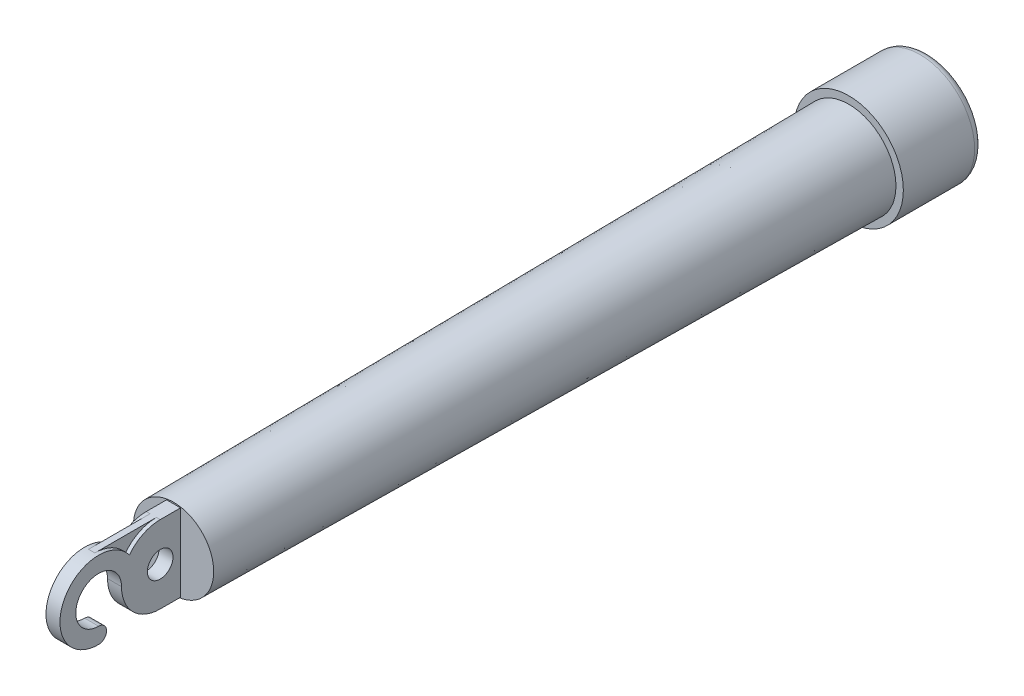
ISO-10303-21;
HEADER;
FILE_DESCRIPTION(('STEP AP214'),'2;1');
FILE_NAME('part.step','',(''),(''),'','','');
FILE_SCHEMA(('AUTOMOTIVE_DESIGN { 1 0 10303 214 1 1 1 1 }'));
ENDSEC;
DATA;
#1=APPLICATION_CONTEXT('core data for automotive mechanical design processes');
#2=APPLICATION_PROTOCOL_DEFINITION('international standard','automotive_design',2000,#1);
#3=PRODUCT_CONTEXT('',#1,'mechanical');
#4=PRODUCT('Part','Part','',(#3));
#5=PRODUCT_RELATED_PRODUCT_CATEGORY('part','',(#4));
#6=PRODUCT_DEFINITION_FORMATION('','',#4);
#7=PRODUCT_DEFINITION_CONTEXT('part definition',#1,'design');
#8=PRODUCT_DEFINITION('design','',#6,#7);
#9=PRODUCT_DEFINITION_SHAPE('','',#8);
#10=(LENGTH_UNIT() NAMED_UNIT(*) SI_UNIT(.MILLI.,.METRE.));
#11=(NAMED_UNIT(*) PLANE_ANGLE_UNIT() SI_UNIT($,.RADIAN.));
#12=(NAMED_UNIT(*) SI_UNIT($,.STERADIAN.) SOLID_ANGLE_UNIT());
#13=UNCERTAINTY_MEASURE_WITH_UNIT(LENGTH_MEASURE(1.E-05),#10,'distance_accuracy_value','');
#14=(GEOMETRIC_REPRESENTATION_CONTEXT(3) GLOBAL_UNCERTAINTY_ASSIGNED_CONTEXT((#13)) GLOBAL_UNIT_ASSIGNED_CONTEXT((#10,
#11,#12)) REPRESENTATION_CONTEXT('',''));
#15=CARTESIAN_POINT('',(0.,0.,0.));
#16=DIRECTION('',(0.,0.,1.));
#17=DIRECTION('',(1.,0.,0.));
#18=AXIS2_PLACEMENT_3D('',#15,#16,#17);
#19=CARTESIAN_POINT('',(-1.2,6.65,150.39));
#20=DIRECTION('',(0.,-1.,0.));
#21=DIRECTION('',(0.,0.,-1.));
#22=AXIS2_PLACEMENT_3D('',#19,#20,#21);
#23=PLANE('',#22);
#24=DIRECTION('',(-1.,0.,0.));
#25=VECTOR('',#24,1.);
#26=CARTESIAN_POINT('',(-0.545,6.64999999999998,133.164251340283));
#27=LINE('',#26,#25);
#28=CARTESIAN_POINT('',(-0.545,6.64999999999998,133.164251340283));
#29=VERTEX_POINT('',#28);
#30=CARTESIAN_POINT('',(-1.2,6.64999999999998,133.164251340283));
#31=VERTEX_POINT('',#30);
#32=EDGE_CURVE('E170',#29,#31,#27,.T.);
#33=ORIENTED_EDGE('',*,*,#32,.F.);
#34=DIRECTION('',(0.,0.,1.));
#35=VECTOR('',#34,1.);
#36=CARTESIAN_POINT('',(-0.545,6.65000000000001,143.739251340283));
#37=LINE('',#36,#35);
#38=CARTESIAN_POINT('',(-0.545,6.65000000000001,143.739251340283));
#39=VERTEX_POINT('',#38);
#40=EDGE_CURVE('E166',#29,#39,#37,.T.);
#41=ORIENTED_EDGE('',*,*,#40,.T.);
#42=DIRECTION('',(1.,0.,0.));
#43=VECTOR('',#42,1.);
#44=CARTESIAN_POINT('',(-9.376,6.65000000000001,143.739251340283));
#45=LINE('',#44,#43);
#46=CARTESIAN_POINT('',(0.545,6.65000000000001,143.739251340283));
#47=VERTEX_POINT('',#46);
#48=EDGE_CURVE('E53',#39,#47,#45,.T.);
#49=ORIENTED_EDGE('',*,*,#48,.T.);
#50=DIRECTION('',(0.,0.,1.));
#51=VECTOR('',#50,1.);
#52=CARTESIAN_POINT('',(0.545,6.65000000000001,143.739251340283));
#53=LINE('',#52,#51);
#54=CARTESIAN_POINT('',(0.545,6.64999999999998,133.164251340283));
#55=VERTEX_POINT('',#54);
#56=EDGE_CURVE('E184',#55,#47,#53,.T.);
#57=ORIENTED_EDGE('',*,*,#56,.F.);
#58=DIRECTION('',(1.,0.,0.));
#59=VECTOR('',#58,1.);
#60=CARTESIAN_POINT('',(0.545,6.64999999999998,133.164251340283));
#61=LINE('',#60,#59);
#62=CARTESIAN_POINT('',(1.2,6.64999999999998,133.164251340283));
#63=VERTEX_POINT('',#62);
#64=EDGE_CURVE('E188',#55,#63,#61,.T.);
#65=ORIENTED_EDGE('',*,*,#64,.T.);
#66=DIRECTION('',(0.,0.,-1.));
#67=VECTOR('',#66,1.);
#68=CARTESIAN_POINT('',(1.2,6.65,150.39));
#69=LINE('',#68,#67);
#70=CARTESIAN_POINT('',(1.2,6.65,129.67));
#71=VERTEX_POINT('',#70);
#72=EDGE_CURVE('E214',#63,#71,#69,.T.);
#73=ORIENTED_EDGE('',*,*,#72,.T.);
#74=DIRECTION('',(-1.,0.,0.));
#75=VECTOR('',#74,1.);
#76=CARTESIAN_POINT('',(-1.2,6.65,129.67));
#77=LINE('',#76,#75);
#78=CARTESIAN_POINT('',(-1.2,6.65,129.67));
#79=VERTEX_POINT('',#78);
#80=EDGE_CURVE('E202',#71,#79,#77,.T.);
#81=ORIENTED_EDGE('',*,*,#80,.T.);
#82=DIRECTION('',(0.,0.,-1.));
#83=VECTOR('',#82,1.);
#84=CARTESIAN_POINT('',(-1.2,6.65,150.39));
#85=LINE('',#84,#83);
#86=EDGE_CURVE('E212',#31,#79,#85,.T.);
#87=ORIENTED_EDGE('',*,*,#86,.F.);
#88=EDGE_LOOP('',(#33,#41,#49,#57,#65,#73,#81,#87));
#89=FACE_BOUND('',#88,.T.);
#90=ADVANCED_FACE('F38',(#89),#23,.F.);
#91=CARTESIAN_POINT('',(-1.2,-6.65,150.39));
#92=DIRECTION('',(1.,0.,0.));
#93=DIRECTION('',(0.,0.,-1.));
#94=AXIS2_PLACEMENT_3D('',#91,#92,#93);
#95=PLANE('',#94);
#96=CARTESIAN_POINT('',(-1.2,0.,133.164251340283));
#97=DIRECTION('',(1.,0.,0.));
#98=DIRECTION('',(0.,0.,-1.));
#99=AXIS2_PLACEMENT_3D('',#96,#97,#98);
#100=CIRCLE('',#99,2.20000000000001);
#101=CARTESIAN_POINT('',(-1.2,0.,130.964251340283));
#102=VERTEX_POINT('',#101);
#103=EDGE_CURVE('E153',#102,#102,#100,.F.);
#104=ORIENTED_EDGE('',*,*,#103,.F.);
#105=EDGE_LOOP('',(#104));
#106=FACE_BOUND('',#105,.T.);
#107=DIRECTION('',(0.,0.,-1.));
#108=VECTOR('',#107,1.);
#109=CARTESIAN_POINT('',(-1.2,-6.65,150.39));
#110=LINE('',#109,#108);
#111=CARTESIAN_POINT('',(-1.2,-6.64999999999998,133.164251340283));
#112=VERTEX_POINT('',#111);
#113=CARTESIAN_POINT('',(-1.2,-6.65,129.67));
#114=VERTEX_POINT('',#113);
#115=EDGE_CURVE('E61',#112,#114,#110,.T.);
#116=ORIENTED_EDGE('',*,*,#115,.F.);
#117=CARTESIAN_POINT('',(-1.2,0.,133.164251340283));
#118=DIRECTION('',(1.,0.,0.));
#119=DIRECTION('',(0.,0.,-1.));
#120=AXIS2_PLACEMENT_3D('',#117,#118,#119);
#121=CIRCLE('',#120,6.64999999999998);
#122=CARTESIAN_POINT('',(-1.2,0.,139.814251340283));
#123=VERTEX_POINT('',#122);
#124=EDGE_CURVE('E132',#123,#112,#121,.T.);
#125=ORIENTED_EDGE('',*,*,#124,.F.);
#126=CARTESIAN_POINT('',(-1.2,0.,143.739251340283));
#127=DIRECTION('',(1.,0.,0.));
#128=DIRECTION('',(0.,0.,-1.));
#129=AXIS2_PLACEMENT_3D('',#126,#127,#128);
#130=CIRCLE('',#129,3.92500000000001);
#131=CARTESIAN_POINT('',(-1.2,-3.925,143.739251340283));
#132=VERTEX_POINT('',#131);
#133=EDGE_CURVE('E126',#132,#123,#130,.F.);
#134=ORIENTED_EDGE('',*,*,#133,.F.);
#135=CARTESIAN_POINT('',(-1.2,-5.28750000000001,143.739251340283));
#136=DIRECTION('',(1.,0.,0.));
#137=DIRECTION('',(0.,0.,-1.));
#138=AXIS2_PLACEMENT_3D('',#135,#136,#137);
#139=CIRCLE('',#138,1.36250000000001);
#140=CARTESIAN_POINT('',(-1.2,-6.65000000000002,143.739251340283));
#141=VERTEX_POINT('',#140);
#142=EDGE_CURVE('E130',#132,#141,#139,.F.);
#143=ORIENTED_EDGE('',*,*,#142,.T.);
#144=CARTESIAN_POINT('',(-1.2,0.,143.739251340283));
#145=DIRECTION('',(1.,0.,0.));
#146=DIRECTION('',(0.,0.,-1.));
#147=AXIS2_PLACEMENT_3D('',#144,#145,#146);
#148=CIRCLE('',#147,6.65000000000001);
#149=CARTESIAN_POINT('',(-1.2,4.03296959447997,138.451751340283));
#150=VERTEX_POINT('',#149);
#151=EDGE_CURVE('E191',#150,#141,#148,.T.);
#152=ORIENTED_EDGE('',*,*,#151,.F.);
#153=CARTESIAN_POINT('',(-1.2,0.,133.164251340283));
#154=DIRECTION('',(-1.,0.,0.));
#155=DIRECTION('',(0.,0.,1.));
#156=AXIS2_PLACEMENT_3D('',#153,#154,#155);
#157=CIRCLE('',#156,6.64999999999997);
#158=EDGE_CURVE('E161',#150,#31,#157,.T.);
#159=ORIENTED_EDGE('',*,*,#158,.T.);
#160=ORIENTED_EDGE('',*,*,#86,.T.);
#161=DIRECTION('',(0.,-1.,0.));
#162=VECTOR('',#161,1.);
#163=CARTESIAN_POINT('',(-1.2,-6.65,129.67));
#164=LINE('',#163,#162);
#165=EDGE_CURVE('E205',#79,#114,#164,.T.);
#166=ORIENTED_EDGE('',*,*,#165,.T.);
#167=EDGE_LOOP('',(#116,#125,#134,#143,#152,#159,#160,#166));
#168=FACE_BOUND('',#167,.T.);
#169=ADVANCED_FACE('F128',(#106,#168),#95,.F.);
#170=CARTESIAN_POINT('',(0.,0.,129.67));
#171=DIRECTION('',(0.,0.,1.));
#172=DIRECTION('',(1.,0.,0.));
#173=AXIS2_PLACEMENT_3D('',#170,#171,#172);
#174=PLANE('',#173);
#175=CARTESIAN_POINT('',(0.,0.,129.67));
#176=DIRECTION('',(0.,0.,1.));
#177=DIRECTION('',(1.,0.,0.));
#178=AXIS2_PLACEMENT_3D('',#175,#176,#177);
#179=CIRCLE('',#178,6.9);
#180=CARTESIAN_POINT('',(6.9,0.,129.67));
#181=VERTEX_POINT('',#180);
#182=EDGE_CURVE('E221',#181,#181,#179,.T.);
#183=ORIENTED_EDGE('',*,*,#182,.T.);
#184=EDGE_LOOP('',(#183));
#185=FACE_BOUND('',#184,.T.);
#186=ORIENTED_EDGE('',*,*,#80,.F.);
#187=DIRECTION('',(0.,1.,0.));
#188=VECTOR('',#187,1.);
#189=CARTESIAN_POINT('',(1.2,-6.65,129.67));
#190=LINE('',#189,#188);
#191=CARTESIAN_POINT('',(1.2,-6.65,129.67));
#192=VERTEX_POINT('',#191);
#193=EDGE_CURVE('E198',#192,#71,#190,.T.);
#194=ORIENTED_EDGE('',*,*,#193,.F.);
#195=DIRECTION('',(1.,0.,0.));
#196=VECTOR('',#195,1.);
#197=CARTESIAN_POINT('',(-1.2,-6.65,129.67));
#198=LINE('',#197,#196);
#199=EDGE_CURVE('E207',#114,#192,#198,.T.);
#200=ORIENTED_EDGE('',*,*,#199,.F.);
#201=ORIENTED_EDGE('',*,*,#165,.F.);
#202=EDGE_LOOP('',(#186,#194,#200,#201));
#203=FACE_BOUND('',#202,.T.);
#204=ADVANCED_FACE('F238',(#185,#203),#174,.T.);
#205=CARTESIAN_POINT('',(0.,0.,13.65));
#206=DIRECTION('',(0.,0.,1.));
#207=DIRECTION('',(1.,0.,0.));
#208=AXIS2_PLACEMENT_3D('',#205,#206,#207);
#209=PLANE('',#208);
#210=CARTESIAN_POINT('',(0.,0.,13.65));
#211=DIRECTION('',(0.,0.,1.));
#212=DIRECTION('',(1.,0.,0.));
#213=AXIS2_PLACEMENT_3D('',#210,#211,#212);
#214=CIRCLE('',#213,9.375);
#215=CARTESIAN_POINT('',(9.375,0.,13.65));
#216=VERTEX_POINT('',#215);
#217=EDGE_CURVE('E498',#216,#216,#214,.T.);
#218=ORIENTED_EDGE('',*,*,#217,.T.);
#219=EDGE_LOOP('',(#218));
#220=FACE_BOUND('',#219,.T.);
#221=CARTESIAN_POINT('',(0.,0.,13.65));
#222=DIRECTION('',(0.,0.,1.));
#223=DIRECTION('',(1.,0.,0.));
#224=AXIS2_PLACEMENT_3D('',#221,#222,#223);
#225=CIRCLE('',#224,8.105);
#226=CARTESIAN_POINT('',(8.105,0.,13.65));
#227=VERTEX_POINT('',#226);
#228=EDGE_CURVE('E216',#227,#227,#225,.T.);
#229=ORIENTED_EDGE('',*,*,#228,.F.);
#230=EDGE_LOOP('',(#229));
#231=FACE_BOUND('',#230,.T.);
#232=ADVANCED_FACE('F250',(#220,#231),#209,.T.);
#233=CARTESIAN_POINT('',(0.,0.,13.65));
#234=DIRECTION('',(0.,0.,-1.));
#235=DIRECTION('',(-1.,0.,0.));
#236=AXIS2_PLACEMENT_3D('',#233,#234,#235);
#237=CYLINDRICAL_SURFACE('',#236,9.375);
#238=CARTESIAN_POINT('',(0.,0.,1.4));
#239=DIRECTION('',(0.,0.,1.));
#240=DIRECTION('',(1.,0.,0.));
#241=AXIS2_PLACEMENT_3D('',#238,#239,#240);
#242=CIRCLE('',#241,9.375);
#243=CARTESIAN_POINT('',(9.375,0.,1.4));
#244=VERTEX_POINT('',#243);
#245=EDGE_CURVE('E493',#244,#244,#242,.T.);
#246=ORIENTED_EDGE('',*,*,#245,.T.);
#247=EDGE_LOOP('',(#246));
#248=FACE_BOUND('',#247,.T.);
#249=ORIENTED_EDGE('',*,*,#217,.F.);
#250=EDGE_LOOP('',(#249));
#251=FACE_BOUND('',#250,.T.);
#252=ADVANCED_FACE('F253',(#248,#251),#237,.T.);
#253=CARTESIAN_POINT('',(0.,0.,0.));
#254=DIRECTION('',(0.,0.,1.));
#255=DIRECTION('',(1.,0.,0.));
#256=AXIS2_PLACEMENT_3D('',#253,#254,#255);
#257=PLANE('',#256);
#258=CARTESIAN_POINT('',(0.,0.,0.));
#259=DIRECTION('',(0.,0.,1.));
#260=DIRECTION('',(1.,0.,0.));
#261=AXIS2_PLACEMENT_3D('',#258,#259,#260);
#262=CIRCLE('',#261,5.4);
#263=CARTESIAN_POINT('',(5.4,0.,0.));
#264=VERTEX_POINT('',#263);
#265=EDGE_CURVE('E12',#264,#264,#262,.T.);
#266=ORIENTED_EDGE('',*,*,#265,.T.);
#267=EDGE_LOOP('',(#266));
#268=FACE_BOUND('',#267,.T.);
#269=CARTESIAN_POINT('',(0.,0.,0.));
#270=DIRECTION('',(0.,0.,1.));
#271=DIRECTION('',(1.,0.,0.));
#272=AXIS2_PLACEMENT_3D('',#269,#270,#271);
#273=CIRCLE('',#272,7.975);
#274=CARTESIAN_POINT('',(7.975,0.,0.));
#275=VERTEX_POINT('',#274);
#276=EDGE_CURVE('E491',#275,#275,#273,.F.);
#277=ORIENTED_EDGE('',*,*,#276,.T.);
#278=EDGE_LOOP('',(#277));
#279=FACE_BOUND('',#278,.T.);
#280=ADVANCED_FACE('F255',(#268,#279),#257,.F.);
#281=CARTESIAN_POINT('',(0.,0.,1.4));
#282=DIRECTION('',(0.,0.,1.));
#283=DIRECTION('',(1.,0.,0.));
#284=AXIS2_PLACEMENT_3D('',#281,#282,#283);
#285=TOROIDAL_SURFACE('',#284,7.975,1.4);
#286=ORIENTED_EDGE('',*,*,#276,.F.);
#287=EDGE_LOOP('',(#286));
#288=FACE_BOUND('',#287,.T.);
#289=ORIENTED_EDGE('',*,*,#245,.F.);
#290=EDGE_LOOP('',(#289));
#291=FACE_BOUND('',#290,.T.);
#292=ADVANCED_FACE('F248',(#288,#291),#285,.T.);
#293=CARTESIAN_POINT('',(0.,0.,9.3));
#294=DIRECTION('',(0.,0.,-1.));
#295=DIRECTION('',(-1.,0.,0.));
#296=AXIS2_PLACEMENT_3D('',#293,#294,#295);
#297=CYLINDRICAL_SURFACE('',#296,4.4);
#298=CARTESIAN_POINT('',(0.,0.,0.999999999999999));
#299=DIRECTION('',(0.,0.,1.));
#300=DIRECTION('',(1.,0.,0.));
#301=AXIS2_PLACEMENT_3D('',#298,#299,#300);
#302=CIRCLE('',#301,4.4);
#303=CARTESIAN_POINT('',(4.4,0.,0.999999999999999));
#304=VERTEX_POINT('',#303);
#305=EDGE_CURVE('E46',#304,#304,#302,.F.);
#306=ORIENTED_EDGE('',*,*,#305,.T.);
#307=EDGE_LOOP('',(#306));
#308=FACE_BOUND('',#307,.T.);
#309=CARTESIAN_POINT('',(0.,0.,9.3));
#310=DIRECTION('',(0.,0.,-1.));
#311=DIRECTION('',(-1.,0.,0.));
#312=AXIS2_PLACEMENT_3D('',#309,#310,#311);
#313=CIRCLE('',#312,4.4);
#314=CARTESIAN_POINT('',(-4.4,0.,9.3));
#315=VERTEX_POINT('',#314);
#316=EDGE_CURVE('E501',#315,#315,#313,.T.);
#317=ORIENTED_EDGE('',*,*,#316,.F.);
#318=EDGE_LOOP('',(#317));
#319=FACE_BOUND('',#318,.T.);
#320=ADVANCED_FACE('F244',(#308,#319),#297,.F.);
#321=CARTESIAN_POINT('',(0.,0.,9.3));
#322=DIRECTION('',(0.,0.,-1.));
#323=DIRECTION('',(-1.,0.,0.));
#324=AXIS2_PLACEMENT_3D('',#321,#322,#323);
#325=PLANE('',#324);
#326=ORIENTED_EDGE('',*,*,#316,.T.);
#327=EDGE_LOOP('',(#326));
#328=FACE_BOUND('',#327,.T.);
#329=ADVANCED_FACE('F241',(#328),#325,.T.);
#330=CARTESIAN_POINT('',(0.,0.,0.999999999999999));
#331=DIRECTION('',(0.,0.,1.));
#332=DIRECTION('',(1.,0.,0.));
#333=AXIS2_PLACEMENT_3D('',#330,#331,#332);
#334=TOROIDAL_SURFACE('',#333,5.4,1.);
#335=ORIENTED_EDGE('',*,*,#265,.F.);
#336=EDGE_LOOP('',(#335));
#337=FACE_BOUND('',#336,.T.);
#338=ORIENTED_EDGE('',*,*,#305,.F.);
#339=EDGE_LOOP('',(#338));
#340=FACE_BOUND('',#339,.T.);
#341=ADVANCED_FACE('F40',(#337,#340),#334,.T.);
#342=CARTESIAN_POINT('',(0.,0.,129.67));
#343=DIRECTION('',(0.,0.,-1.));
#344=DIRECTION('',(-1.,0.,0.));
#345=AXIS2_PLACEMENT_3D('',#342,#343,#344);
#346=CONICAL_SURFACE('',#345,6.9,0.0103857668872033);
#347=ORIENTED_EDGE('',*,*,#182,.F.);
#348=EDGE_LOOP('',(#347));
#349=FACE_BOUND('',#348,.T.);
#350=ORIENTED_EDGE('',*,*,#228,.T.);
#351=EDGE_LOOP('',(#350));
#352=FACE_BOUND('',#351,.T.);
#353=ADVANCED_FACE('F227',(#349,#352),#346,.T.);
#354=CARTESIAN_POINT('',(1.2,-6.65,150.39));
#355=DIRECTION('',(-1.,0.,0.));
#356=DIRECTION('',(0.,0.,1.));
#357=AXIS2_PLACEMENT_3D('',#354,#355,#356);
#358=PLANE('',#357);
#359=CARTESIAN_POINT('',(1.2,0.,133.164251340283));
#360=DIRECTION('',(1.,0.,0.));
#361=DIRECTION('',(0.,0.,-1.));
#362=AXIS2_PLACEMENT_3D('',#359,#360,#361);
#363=CIRCLE('',#362,2.20000000000001);
#364=CARTESIAN_POINT('',(1.2,0.,130.964251340283));
#365=VERTEX_POINT('',#364);
#366=EDGE_CURVE('E286',#365,#365,#363,.T.);
#367=ORIENTED_EDGE('',*,*,#366,.F.);
#368=EDGE_LOOP('',(#367));
#369=FACE_BOUND('',#368,.T.);
#370=CARTESIAN_POINT('',(1.2,0.,143.739251340283));
#371=DIRECTION('',(1.,0.,0.));
#372=DIRECTION('',(0.,0.,-1.));
#373=AXIS2_PLACEMENT_3D('',#370,#371,#372);
#374=CIRCLE('',#373,3.92500000000001);
#375=CARTESIAN_POINT('',(1.2,0.,139.814251340283));
#376=VERTEX_POINT('',#375);
#377=CARTESIAN_POINT('',(1.2,-3.92500000000001,143.739251340283));
#378=VERTEX_POINT('',#377);
#379=EDGE_CURVE('E135',#376,#378,#374,.T.);
#380=ORIENTED_EDGE('',*,*,#379,.F.);
#381=CARTESIAN_POINT('',(1.2,0.,133.164251340283));
#382=DIRECTION('',(-1.,0.,0.));
#383=DIRECTION('',(0.,0.,1.));
#384=AXIS2_PLACEMENT_3D('',#381,#382,#383);
#385=CIRCLE('',#384,6.64999999999998);
#386=CARTESIAN_POINT('',(1.2,-6.64999999999998,133.164251340283));
#387=VERTEX_POINT('',#386);
#388=EDGE_CURVE('E151',#387,#376,#385,.T.);
#389=ORIENTED_EDGE('',*,*,#388,.F.);
#390=DIRECTION('',(0.,0.,-1.));
#391=VECTOR('',#390,1.);
#392=CARTESIAN_POINT('',(1.2,-6.65,150.39));
#393=LINE('',#392,#391);
#394=EDGE_CURVE('E209',#387,#192,#393,.T.);
#395=ORIENTED_EDGE('',*,*,#394,.T.);
#396=ORIENTED_EDGE('',*,*,#193,.T.);
#397=ORIENTED_EDGE('',*,*,#72,.F.);
#398=CARTESIAN_POINT('',(1.2,0.,133.164251340283));
#399=DIRECTION('',(-1.,0.,0.));
#400=DIRECTION('',(0.,0.,1.));
#401=AXIS2_PLACEMENT_3D('',#398,#399,#400);
#402=CIRCLE('',#401,6.64999999999997);
#403=CARTESIAN_POINT('',(1.2,4.03296959447997,138.451751340283));
#404=VERTEX_POINT('',#403);
#405=EDGE_CURVE('E176',#404,#63,#402,.T.);
#406=ORIENTED_EDGE('',*,*,#405,.F.);
#407=CARTESIAN_POINT('',(1.2,0.,143.739251340283));
#408=DIRECTION('',(-1.,0.,0.));
#409=DIRECTION('',(0.,0.,-1.));
#410=AXIS2_PLACEMENT_3D('',#407,#408,#409);
#411=CIRCLE('',#410,6.65000000000001);
#412=CARTESIAN_POINT('',(1.2,-6.65000000000002,143.739251340283));
#413=VERTEX_POINT('',#412);
#414=EDGE_CURVE('E195',#413,#404,#411,.T.);
#415=ORIENTED_EDGE('',*,*,#414,.F.);
#416=CARTESIAN_POINT('',(1.2,-5.28750000000001,143.739251340283));
#417=DIRECTION('',(1.,0.,0.));
#418=DIRECTION('',(0.,0.,-1.));
#419=AXIS2_PLACEMENT_3D('',#416,#417,#418);
#420=CIRCLE('',#419,1.36250000000001);
#421=EDGE_CURVE('E149',#413,#378,#420,.T.);
#422=ORIENTED_EDGE('',*,*,#421,.T.);
#423=EDGE_LOOP('',(#380,#389,#395,#396,#397,#406,#415,#422));
#424=FACE_BOUND('',#423,.T.);
#425=ADVANCED_FACE('F237',(#369,#424),#358,.F.);
#426=CARTESIAN_POINT('',(-1.2,-6.65,150.39));
#427=DIRECTION('',(0.,1.,0.));
#428=DIRECTION('',(0.,0.,1.));
#429=AXIS2_PLACEMENT_3D('',#426,#427,#428);
#430=PLANE('',#429);
#431=ORIENTED_EDGE('',*,*,#394,.F.);
#432=DIRECTION('',(1.,0.,0.));
#433=VECTOR('',#432,1.);
#434=CARTESIAN_POINT('',(-9.376,-6.64999999999998,133.164251340283));
#435=LINE('',#434,#433);
#436=EDGE_CURVE('E136',#112,#387,#435,.T.);
#437=ORIENTED_EDGE('',*,*,#436,.F.);
#438=ORIENTED_EDGE('',*,*,#115,.T.);
#439=ORIENTED_EDGE('',*,*,#199,.T.);
#440=EDGE_LOOP('',(#431,#437,#438,#439));
#441=FACE_BOUND('',#440,.T.);
#442=ADVANCED_FACE('F277',(#441),#430,.F.);
#443=CARTESIAN_POINT('',(-9.376,0.,143.739251340283));
#444=DIRECTION('',(1.,0.,0.));
#445=DIRECTION('',(0.,0.,-1.));
#446=AXIS2_PLACEMENT_3D('',#443,#444,#445);
#447=CYLINDRICAL_SURFACE('',#446,6.65000000000001);
#448=ORIENTED_EDGE('',*,*,#151,.T.);
#449=DIRECTION('',(1.,0.,0.));
#450=VECTOR('',#449,1.);
#451=CARTESIAN_POINT('',(-9.376,-6.65000000000002,143.739251340283));
#452=LINE('',#451,#450);
#453=EDGE_CURVE('E148',#141,#413,#452,.T.);
#454=ORIENTED_EDGE('',*,*,#453,.T.);
#455=ORIENTED_EDGE('',*,*,#414,.T.);
#456=DIRECTION('',(1.,0.,0.));
#457=VECTOR('',#456,1.);
#458=CARTESIAN_POINT('',(0.545,4.03296959447997,138.451751340283));
#459=LINE('',#458,#457);
#460=CARTESIAN_POINT('',(0.545,4.03296959447997,138.451751340283));
#461=VERTEX_POINT('',#460);
#462=EDGE_CURVE('E186',#461,#404,#459,.T.);
#463=ORIENTED_EDGE('',*,*,#462,.F.);
#464=CARTESIAN_POINT('',(0.545,0.,143.739251340283));
#465=DIRECTION('',(-1.,0.,0.));
#466=DIRECTION('',(0.,0.,1.));
#467=AXIS2_PLACEMENT_3D('',#464,#465,#466);
#468=CIRCLE('',#467,6.65000000000001);
#469=EDGE_CURVE('E178',#47,#461,#468,.T.);
#470=ORIENTED_EDGE('',*,*,#469,.F.);
#471=ORIENTED_EDGE('',*,*,#48,.F.);
#472=CARTESIAN_POINT('',(-0.545,0.,143.739251340283));
#473=DIRECTION('',(-1.,0.,0.));
#474=DIRECTION('',(0.,0.,1.));
#475=AXIS2_PLACEMENT_3D('',#472,#473,#474);
#476=CIRCLE('',#475,6.65000000000001);
#477=CARTESIAN_POINT('',(-0.545,4.03296959447997,138.451751340283));
#478=VERTEX_POINT('',#477);
#479=EDGE_CURVE('E163',#39,#478,#476,.T.);
#480=ORIENTED_EDGE('',*,*,#479,.T.);
#481=DIRECTION('',(-1.,0.,0.));
#482=VECTOR('',#481,1.);
#483=CARTESIAN_POINT('',(-0.545,4.03296959447997,138.451751340283));
#484=LINE('',#483,#482);
#485=EDGE_CURVE('E173',#478,#150,#484,.T.);
#486=ORIENTED_EDGE('',*,*,#485,.T.);
#487=EDGE_LOOP('',(#448,#454,#455,#463,#470,#471,#480,#486));
#488=FACE_BOUND('',#487,.T.);
#489=ADVANCED_FACE('F282',(#488),#447,.T.);
#490=CARTESIAN_POINT('',(0.545,0.,133.164251340283));
#491=DIRECTION('',(1.,0.,0.));
#492=DIRECTION('',(0.,0.,-1.));
#493=AXIS2_PLACEMENT_3D('',#490,#491,#492);
#494=CYLINDRICAL_SURFACE('',#493,6.64999999999997);
#495=ORIENTED_EDGE('',*,*,#405,.T.);
#496=ORIENTED_EDGE('',*,*,#64,.F.);
#497=CARTESIAN_POINT('',(0.545,0.,133.164251340283));
#498=DIRECTION('',(-1.,0.,0.));
#499=DIRECTION('',(0.,0.,1.));
#500=AXIS2_PLACEMENT_3D('',#497,#498,#499);
#501=CIRCLE('',#500,6.64999999999997);
#502=EDGE_CURVE('E181',#461,#55,#501,.T.);
#503=ORIENTED_EDGE('',*,*,#502,.F.);
#504=ORIENTED_EDGE('',*,*,#462,.T.);
#505=EDGE_LOOP('',(#495,#496,#503,#504));
#506=FACE_BOUND('',#505,.T.);
#507=ADVANCED_FACE('F296',(#506),#494,.T.);
#508=CARTESIAN_POINT('',(0.545,0.,143.739251340283));
#509=DIRECTION('',(-1.,0.,0.));
#510=DIRECTION('',(0.,0.,1.));
#511=AXIS2_PLACEMENT_3D('',#508,#509,#510);
#512=PLANE('',#511);
#513=ORIENTED_EDGE('',*,*,#469,.T.);
#514=ORIENTED_EDGE('',*,*,#502,.T.);
#515=ORIENTED_EDGE('',*,*,#56,.T.);
#516=EDGE_LOOP('',(#513,#514,#515));
#517=FACE_BOUND('',#516,.T.);
#518=ADVANCED_FACE('F298',(#517),#512,.F.);
#519=CARTESIAN_POINT('',(-0.545,0.,133.164251340283));
#520=DIRECTION('',(-1.,0.,0.));
#521=DIRECTION('',(0.,0.,1.));
#522=AXIS2_PLACEMENT_3D('',#519,#520,#521);
#523=CYLINDRICAL_SURFACE('',#522,6.64999999999997);
#524=ORIENTED_EDGE('',*,*,#158,.F.);
#525=ORIENTED_EDGE('',*,*,#485,.F.);
#526=CARTESIAN_POINT('',(-0.545,0.,133.164251340283));
#527=DIRECTION('',(-1.,0.,0.));
#528=DIRECTION('',(0.,0.,1.));
#529=AXIS2_PLACEMENT_3D('',#526,#527,#528);
#530=CIRCLE('',#529,6.64999999999997);
#531=EDGE_CURVE('E168',#478,#29,#530,.T.);
#532=ORIENTED_EDGE('',*,*,#531,.T.);
#533=ORIENTED_EDGE('',*,*,#32,.T.);
#534=EDGE_LOOP('',(#524,#525,#532,#533));
#535=FACE_BOUND('',#534,.T.);
#536=ADVANCED_FACE('F304',(#535),#523,.T.);
#537=CARTESIAN_POINT('',(-0.545,0.,143.739251340283));
#538=DIRECTION('',(1.,0.,0.));
#539=DIRECTION('',(0.,0.,1.));
#540=AXIS2_PLACEMENT_3D('',#537,#538,#539);
#541=PLANE('',#540);
#542=ORIENTED_EDGE('',*,*,#479,.F.);
#543=ORIENTED_EDGE('',*,*,#40,.F.);
#544=ORIENTED_EDGE('',*,*,#531,.F.);
#545=EDGE_LOOP('',(#542,#543,#544));
#546=FACE_BOUND('',#545,.T.);
#547=ADVANCED_FACE('F321',(#546),#541,.F.);
#548=CARTESIAN_POINT('',(-9.376,0.,143.739251340283));
#549=DIRECTION('',(1.,0.,0.));
#550=DIRECTION('',(0.,0.,-1.));
#551=AXIS2_PLACEMENT_3D('',#548,#549,#550);
#552=CYLINDRICAL_SURFACE('',#551,3.92500000000001);
#553=ORIENTED_EDGE('',*,*,#133,.T.);
#554=DIRECTION('',(1.,0.,0.));
#555=VECTOR('',#554,1.);
#556=CARTESIAN_POINT('',(-9.376,0.,139.814251340283));
#557=LINE('',#556,#555);
#558=EDGE_CURVE('E145',#123,#376,#557,.T.);
#559=ORIENTED_EDGE('',*,*,#558,.T.);
#560=ORIENTED_EDGE('',*,*,#379,.T.);
#561=DIRECTION('',(1.,0.,0.));
#562=VECTOR('',#561,1.);
#563=CARTESIAN_POINT('',(-9.376,-3.92500000000001,143.739251340283));
#564=LINE('',#563,#562);
#565=EDGE_CURVE('E139',#132,#378,#564,.T.);
#566=ORIENTED_EDGE('',*,*,#565,.F.);
#567=EDGE_LOOP('',(#553,#559,#560,#566));
#568=FACE_BOUND('',#567,.T.);
#569=ADVANCED_FACE('F140',(#568),#552,.F.);
#570=CARTESIAN_POINT('',(-9.376,0.,133.164251340283));
#571=DIRECTION('',(1.,0.,0.));
#572=DIRECTION('',(0.,0.,-1.));
#573=AXIS2_PLACEMENT_3D('',#570,#571,#572);
#574=CYLINDRICAL_SURFACE('',#573,6.64999999999998);
#575=ORIENTED_EDGE('',*,*,#124,.T.);
#576=ORIENTED_EDGE('',*,*,#436,.T.);
#577=ORIENTED_EDGE('',*,*,#388,.T.);
#578=ORIENTED_EDGE('',*,*,#558,.F.);
#579=EDGE_LOOP('',(#575,#576,#577,#578));
#580=FACE_BOUND('',#579,.T.);
#581=ADVANCED_FACE('F312',(#580),#574,.T.);
#582=CARTESIAN_POINT('',(-4.24664261934349,-5.28750000000001,143.739251340283));
#583=DIRECTION('',(1.,0.,0.));
#584=DIRECTION('',(0.,0.,-1.));
#585=AXIS2_PLACEMENT_3D('',#582,#583,#584);
#586=CYLINDRICAL_SURFACE('',#585,1.36250000000001);
#587=ORIENTED_EDGE('',*,*,#142,.F.);
#588=ORIENTED_EDGE('',*,*,#565,.T.);
#589=ORIENTED_EDGE('',*,*,#421,.F.);
#590=ORIENTED_EDGE('',*,*,#453,.F.);
#591=EDGE_LOOP('',(#587,#588,#589,#590));
#592=FACE_BOUND('',#591,.T.);
#593=ADVANCED_FACE('F147',(#592),#586,.T.);
#594=CARTESIAN_POINT('',(-9.376,0.,133.164251340283));
#595=DIRECTION('',(1.,0.,0.));
#596=DIRECTION('',(0.,0.,-1.));
#597=AXIS2_PLACEMENT_3D('',#594,#595,#596);
#598=CYLINDRICAL_SURFACE('',#597,2.20000000000001);
#599=ORIENTED_EDGE('',*,*,#366,.T.);
#600=EDGE_LOOP('',(#599));
#601=FACE_BOUND('',#600,.T.);
#602=ORIENTED_EDGE('',*,*,#103,.T.);
#603=EDGE_LOOP('',(#602));
#604=FACE_BOUND('',#603,.T.);
#605=ADVANCED_FACE('F319',(#601,#604),#598,.F.);
#606=CLOSED_SHELL('',(#90,#169,#204,#232,#252,#280,#292,#320,#329,#341,#353,#425,#442,#489,#507,
#518,#536,#547,#569,#581,#593,#605));
#607=MANIFOLD_SOLID_BREP('B2',#606);
#608=ADVANCED_BREP_SHAPE_REPRESENTATION('',(#18,#607),#14);
#609=SHAPE_DEFINITION_REPRESENTATION(#9,#608);
ENDSEC;
END-ISO-10303-21;
